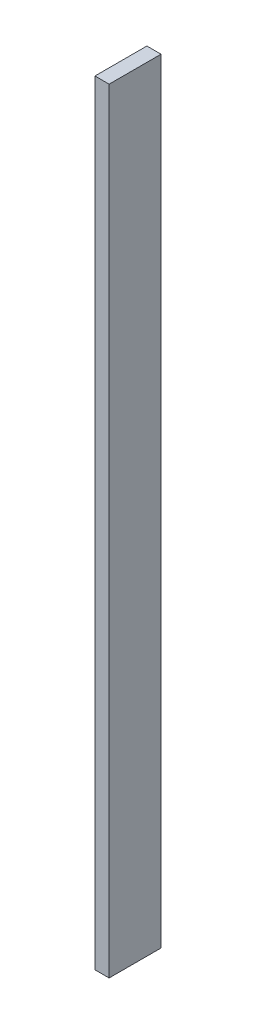
ISO-10303-21;
HEADER;
FILE_DESCRIPTION(('STEP AP214'),'2;1');
FILE_NAME('part.step','',(''),(''),'','','');
FILE_SCHEMA(('AUTOMOTIVE_DESIGN { 1 0 10303 214 1 1 1 1 }'));
ENDSEC;
DATA;
#1=APPLICATION_CONTEXT('core data for automotive mechanical design processes');
#2=APPLICATION_PROTOCOL_DEFINITION('international standard','automotive_design',2000,#1);
#3=PRODUCT_CONTEXT('',#1,'mechanical');
#4=PRODUCT('Part','Part','',(#3));
#5=PRODUCT_RELATED_PRODUCT_CATEGORY('part','',(#4));
#6=PRODUCT_DEFINITION_FORMATION('','',#4);
#7=PRODUCT_DEFINITION_CONTEXT('part definition',#1,'design');
#8=PRODUCT_DEFINITION('design','',#6,#7);
#9=PRODUCT_DEFINITION_SHAPE('','',#8);
#10=(LENGTH_UNIT() NAMED_UNIT(*) SI_UNIT(.MILLI.,.METRE.));
#11=(NAMED_UNIT(*) PLANE_ANGLE_UNIT() SI_UNIT($,.RADIAN.));
#12=(NAMED_UNIT(*) SI_UNIT($,.STERADIAN.) SOLID_ANGLE_UNIT());
#13=UNCERTAINTY_MEASURE_WITH_UNIT(LENGTH_MEASURE(1.E-05),#10,'distance_accuracy_value','');
#14=(GEOMETRIC_REPRESENTATION_CONTEXT(3) GLOBAL_UNCERTAINTY_ASSIGNED_CONTEXT((#13)) GLOBAL_UNIT_ASSIGNED_CONTEXT((#10,
#11,#12)) REPRESENTATION_CONTEXT('',''));
#15=CARTESIAN_POINT('',(0.,0.,0.));
#16=DIRECTION('',(0.,0.,1.));
#17=DIRECTION('',(1.,0.,0.));
#18=AXIS2_PLACEMENT_3D('',#15,#16,#17);
#19=CARTESIAN_POINT('',(19.05,2082.8,69.85));
#20=DIRECTION('',(-1.,0.,0.));
#21=DIRECTION('',(0.,0.,1.));
#22=AXIS2_PLACEMENT_3D('',#19,#20,#21);
#23=PLANE('',#22);
#24=DIRECTION('',(0.,0.,-1.));
#25=VECTOR('',#24,1.);
#26=CARTESIAN_POINT('',(19.05,0.,69.85));
#27=LINE('',#26,#25);
#28=CARTESIAN_POINT('',(19.05,0.,69.85));
#29=VERTEX_POINT('',#28);
#30=CARTESIAN_POINT('',(19.05,0.,-69.85));
#31=VERTEX_POINT('',#30);
#32=EDGE_CURVE('E107',#29,#31,#27,.T.);
#33=ORIENTED_EDGE('',*,*,#32,.T.);
#34=DIRECTION('',(0.,-1.,0.));
#35=VECTOR('',#34,1.);
#36=CARTESIAN_POINT('',(19.05,2082.8,-69.85));
#37=LINE('',#36,#35);
#38=CARTESIAN_POINT('',(19.05,2082.8,-69.85));
#39=VERTEX_POINT('',#38);
#40=EDGE_CURVE('E11',#39,#31,#37,.T.);
#41=ORIENTED_EDGE('',*,*,#40,.F.);
#42=DIRECTION('',(0.,0.,-1.));
#43=VECTOR('',#42,1.);
#44=CARTESIAN_POINT('',(19.05,2082.8,69.85));
#45=LINE('',#44,#43);
#46=CARTESIAN_POINT('',(19.05,2082.8,69.85));
#47=VERTEX_POINT('',#46);
#48=EDGE_CURVE('E91',#47,#39,#45,.T.);
#49=ORIENTED_EDGE('',*,*,#48,.F.);
#50=DIRECTION('',(0.,-1.,0.));
#51=VECTOR('',#50,1.);
#52=CARTESIAN_POINT('',(19.05,2082.8,69.85));
#53=LINE('',#52,#51);
#54=EDGE_CURVE('E103',#47,#29,#53,.T.);
#55=ORIENTED_EDGE('',*,*,#54,.T.);
#56=EDGE_LOOP('',(#33,#41,#49,#55));
#57=FACE_BOUND('',#56,.T.);
#58=ADVANCED_FACE('F39',(#57),#23,.F.);
#59=CARTESIAN_POINT('',(-19.05,2082.8,-69.85));
#60=DIRECTION('',(0.,0.,1.));
#61=DIRECTION('',(1.,0.,0.));
#62=AXIS2_PLACEMENT_3D('',#59,#60,#61);
#63=PLANE('',#62);
#64=DIRECTION('',(-1.,0.,0.));
#65=VECTOR('',#64,1.);
#66=CARTESIAN_POINT('',(-19.05,0.,-69.85));
#67=LINE('',#66,#65);
#68=CARTESIAN_POINT('',(-19.05,0.,-69.85));
#69=VERTEX_POINT('',#68);
#70=EDGE_CURVE('E96',#31,#69,#67,.T.);
#71=ORIENTED_EDGE('',*,*,#70,.T.);
#72=DIRECTION('',(0.,-1.,0.));
#73=VECTOR('',#72,1.);
#74=CARTESIAN_POINT('',(-19.05,2082.8,-69.85));
#75=LINE('',#74,#73);
#76=CARTESIAN_POINT('',(-19.05,2082.8,-69.85));
#77=VERTEX_POINT('',#76);
#78=EDGE_CURVE('E48',#77,#69,#75,.T.);
#79=ORIENTED_EDGE('',*,*,#78,.F.);
#80=DIRECTION('',(-1.,0.,0.));
#81=VECTOR('',#80,1.);
#82=CARTESIAN_POINT('',(-19.05,2082.8,-69.85));
#83=LINE('',#82,#81);
#84=EDGE_CURVE('E86',#39,#77,#83,.T.);
#85=ORIENTED_EDGE('',*,*,#84,.F.);
#86=ORIENTED_EDGE('',*,*,#40,.T.);
#87=EDGE_LOOP('',(#71,#79,#85,#86));
#88=FACE_BOUND('',#87,.T.);
#89=ADVANCED_FACE('F95',(#88),#63,.F.);
#90=CARTESIAN_POINT('',(-19.05,2082.8,69.85));
#91=DIRECTION('',(1.,0.,0.));
#92=DIRECTION('',(0.,0.,-1.));
#93=AXIS2_PLACEMENT_3D('',#90,#91,#92);
#94=PLANE('',#93);
#95=DIRECTION('',(0.,0.,1.));
#96=VECTOR('',#95,1.);
#97=CARTESIAN_POINT('',(-19.05,0.,69.85));
#98=LINE('',#97,#96);
#99=CARTESIAN_POINT('',(-19.05,0.,69.85));
#100=VERTEX_POINT('',#99);
#101=EDGE_CURVE('E73',#69,#100,#98,.T.);
#102=ORIENTED_EDGE('',*,*,#101,.T.);
#103=DIRECTION('',(0.,-1.,0.));
#104=VECTOR('',#103,1.);
#105=CARTESIAN_POINT('',(-19.05,2082.8,69.85));
#106=LINE('',#105,#104);
#107=CARTESIAN_POINT('',(-19.05,2082.8,69.85));
#108=VERTEX_POINT('',#107);
#109=EDGE_CURVE('E98',#108,#100,#106,.T.);
#110=ORIENTED_EDGE('',*,*,#109,.F.);
#111=DIRECTION('',(0.,0.,1.));
#112=VECTOR('',#111,1.);
#113=CARTESIAN_POINT('',(-19.05,2082.8,69.85));
#114=LINE('',#113,#112);
#115=EDGE_CURVE('E89',#77,#108,#114,.T.);
#116=ORIENTED_EDGE('',*,*,#115,.F.);
#117=ORIENTED_EDGE('',*,*,#78,.T.);
#118=EDGE_LOOP('',(#102,#110,#116,#117));
#119=FACE_BOUND('',#118,.T.);
#120=ADVANCED_FACE('F99',(#119),#94,.F.);
#121=CARTESIAN_POINT('',(-19.05,2082.8,69.85));
#122=DIRECTION('',(0.,0.,-1.));
#123=DIRECTION('',(-1.,0.,0.));
#124=AXIS2_PLACEMENT_3D('',#121,#122,#123);
#125=PLANE('',#124);
#126=DIRECTION('',(1.,0.,0.));
#127=VECTOR('',#126,1.);
#128=CARTESIAN_POINT('',(-19.05,0.,69.85));
#129=LINE('',#128,#127);
#130=EDGE_CURVE('E79',#100,#29,#129,.T.);
#131=ORIENTED_EDGE('',*,*,#130,.T.);
#132=ORIENTED_EDGE('',*,*,#54,.F.);
#133=DIRECTION('',(1.,0.,0.));
#134=VECTOR('',#133,1.);
#135=CARTESIAN_POINT('',(-19.05,2082.8,69.85));
#136=LINE('',#135,#134);
#137=EDGE_CURVE('E56',#108,#47,#136,.T.);
#138=ORIENTED_EDGE('',*,*,#137,.F.);
#139=ORIENTED_EDGE('',*,*,#109,.T.);
#140=EDGE_LOOP('',(#131,#132,#138,#139));
#141=FACE_BOUND('',#140,.T.);
#142=ADVANCED_FACE('F120',(#141),#125,.F.);
#143=CARTESIAN_POINT('',(0.,2082.8,0.));
#144=DIRECTION('',(0.,-1.,0.));
#145=DIRECTION('',(0.,0.,-1.));
#146=AXIS2_PLACEMENT_3D('',#143,#144,#145);
#147=PLANE('',#146);
#148=ORIENTED_EDGE('',*,*,#48,.T.);
#149=ORIENTED_EDGE('',*,*,#84,.T.);
#150=ORIENTED_EDGE('',*,*,#115,.T.);
#151=ORIENTED_EDGE('',*,*,#137,.T.);
#152=EDGE_LOOP('',(#148,#149,#150,#151));
#153=FACE_BOUND('',#152,.T.);
#154=ADVANCED_FACE('F87',(#153),#147,.F.);
#155=CARTESIAN_POINT('',(0.,0.,0.));
#156=DIRECTION('',(0.,-1.,0.));
#157=DIRECTION('',(0.,0.,-1.));
#158=AXIS2_PLACEMENT_3D('',#155,#156,#157);
#159=PLANE('',#158);
#160=ORIENTED_EDGE('',*,*,#32,.F.);
#161=ORIENTED_EDGE('',*,*,#130,.F.);
#162=ORIENTED_EDGE('',*,*,#101,.F.);
#163=ORIENTED_EDGE('',*,*,#70,.F.);
#164=EDGE_LOOP('',(#160,#161,#162,#163));
#165=FACE_BOUND('',#164,.T.);
#166=ADVANCED_FACE('F123',(#165),#159,.T.);
#167=CLOSED_SHELL('',(#58,#89,#120,#142,#154,#166));
#168=MANIFOLD_SOLID_BREP('B2',#167);
#169=ADVANCED_BREP_SHAPE_REPRESENTATION('',(#18,#168),#14);
#170=SHAPE_DEFINITION_REPRESENTATION(#9,#169);
ENDSEC;
END-ISO-10303-21;
